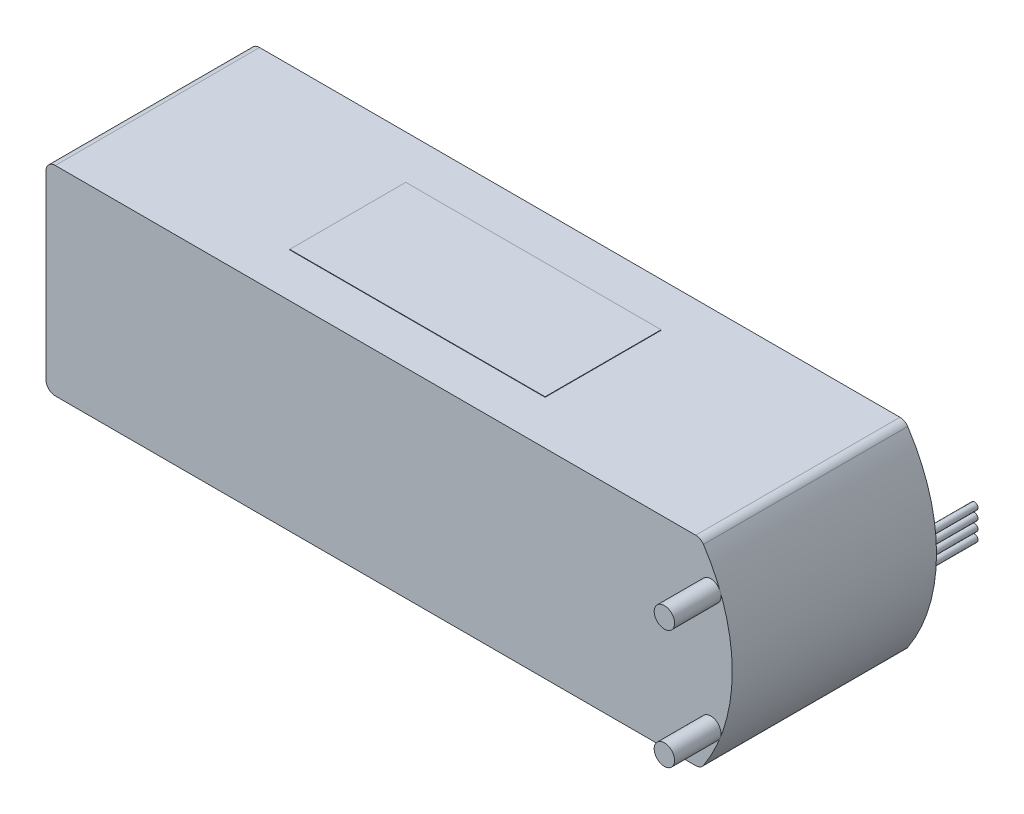
ISO-10303-21;
HEADER;
FILE_DESCRIPTION(('STEP AP214'),'2;1');
FILE_NAME('part.step','',(''),(''),'','','');
FILE_SCHEMA(('AUTOMOTIVE_DESIGN { 1 0 10303 214 1 1 1 1 }'));
ENDSEC;
DATA;
#1=APPLICATION_CONTEXT('core data for automotive mechanical design processes');
#2=APPLICATION_PROTOCOL_DEFINITION('international standard','automotive_design',2000,#1);
#3=PRODUCT_CONTEXT('',#1,'mechanical');
#4=PRODUCT('Part','Part','',(#3));
#5=PRODUCT_RELATED_PRODUCT_CATEGORY('part','',(#4));
#6=PRODUCT_DEFINITION_FORMATION('','',#4);
#7=PRODUCT_DEFINITION_CONTEXT('part definition',#1,'design');
#8=PRODUCT_DEFINITION('design','',#6,#7);
#9=PRODUCT_DEFINITION_SHAPE('','',#8);
#10=(LENGTH_UNIT() NAMED_UNIT(*) SI_UNIT(.MILLI.,.METRE.));
#11=(NAMED_UNIT(*) PLANE_ANGLE_UNIT() SI_UNIT($,.RADIAN.));
#12=(NAMED_UNIT(*) SI_UNIT($,.STERADIAN.) SOLID_ANGLE_UNIT());
#13=UNCERTAINTY_MEASURE_WITH_UNIT(LENGTH_MEASURE(1.E-05),#10,'distance_accuracy_value','');
#14=(GEOMETRIC_REPRESENTATION_CONTEXT(3) GLOBAL_UNCERTAINTY_ASSIGNED_CONTEXT((#13)) GLOBAL_UNIT_ASSIGNED_CONTEXT((#10,
#11,#12)) REPRESENTATION_CONTEXT('',''));
#15=CARTESIAN_POINT('',(0.,0.,0.));
#16=DIRECTION('',(0.,0.,1.));
#17=DIRECTION('',(1.,0.,0.));
#18=AXIS2_PLACEMENT_3D('',#15,#16,#17);
#19=CARTESIAN_POINT('',(75.5,-3.00000000000001,-32.));
#20=DIRECTION('',(0.,0.,1.));
#21=DIRECTION('',(1.,0.,0.));
#22=AXIS2_PLACEMENT_3D('',#19,#20,#21);
#23=CYLINDRICAL_SURFACE('',#22,0.749999999999999);
#24=CARTESIAN_POINT('',(75.5,-3.00000000000001,-32.));
#25=DIRECTION('',(0.,0.,-1.));
#26=DIRECTION('',(1.,0.,0.));
#27=AXIS2_PLACEMENT_3D('',#24,#25,#26);
#28=CIRCLE('',#27,0.749999999999999);
#29=CARTESIAN_POINT('',(76.25,-3.00000000000001,-32.));
#30=VERTEX_POINT('',#29);
#31=EDGE_CURVE('E11',#30,#30,#28,.T.);
#32=ORIENTED_EDGE('',*,*,#31,.F.);
#33=EDGE_LOOP('',(#32));
#34=FACE_BOUND('',#33,.T.);
#35=CARTESIAN_POINT('',(75.5,-3.00000000000001,-22.));
#36=DIRECTION('',(0.,0.,-1.));
#37=DIRECTION('',(1.,0.,0.));
#38=AXIS2_PLACEMENT_3D('',#35,#36,#37);
#39=CIRCLE('',#38,0.749999999999999);
#40=CARTESIAN_POINT('',(76.25,-3.00000000000001,-22.));
#41=VERTEX_POINT('',#40);
#42=EDGE_CURVE('E55',#41,#41,#39,.T.);
#43=ORIENTED_EDGE('',*,*,#42,.T.);
#44=EDGE_LOOP('',(#43));
#45=FACE_BOUND('',#44,.T.);
#46=ADVANCED_FACE('F52',(#34,#45),#23,.T.);
#47=CARTESIAN_POINT('',(75.5,-3.00000000000001,-32.));
#48=DIRECTION('',(0.,0.,1.));
#49=DIRECTION('',(1.,0.,0.));
#50=AXIS2_PLACEMENT_3D('',#47,#48,#49);
#51=PLANE('',#50);
#52=ORIENTED_EDGE('',*,*,#31,.T.);
#53=EDGE_LOOP('',(#52));
#54=FACE_BOUND('',#53,.T.);
#55=ADVANCED_FACE('F67',(#54),#51,.F.);
#56=CARTESIAN_POINT('',(75.5,-3.00000000000001,-22.));
#57=DIRECTION('',(0.,0.,1.));
#58=DIRECTION('',(1.,0.,0.));
#59=AXIS2_PLACEMENT_3D('',#56,#57,#58);
#60=PLANE('',#59);
#61=ORIENTED_EDGE('',*,*,#42,.F.);
#62=EDGE_LOOP('',(#61));
#63=FACE_BOUND('',#62,.T.);
#64=ADVANCED_FACE('F65',(#63),#60,.T.);
#65=CLOSED_SHELL('',(#46,#55,#64));
#66=MANIFOLD_SOLID_BREP('B2',#65);
#67=CARTESIAN_POINT('',(75.5,0.99999999999999,-32.));
#68=DIRECTION('',(0.,0.,1.));
#69=DIRECTION('',(1.,0.,0.));
#70=AXIS2_PLACEMENT_3D('',#67,#68,#69);
#71=CYLINDRICAL_SURFACE('',#70,0.749999999999999);
#72=CARTESIAN_POINT('',(75.5,0.99999999999999,-32.));
#73=DIRECTION('',(0.,0.,-1.));
#74=DIRECTION('',(-1.,0.,0.));
#75=AXIS2_PLACEMENT_3D('',#72,#73,#74);
#76=CIRCLE('',#75,0.749999999999999);
#77=CARTESIAN_POINT('',(74.75,0.99999999999999,-32.));
#78=VERTEX_POINT('',#77);
#79=EDGE_CURVE('E51',#78,#78,#76,.T.);
#80=ORIENTED_EDGE('',*,*,#79,.F.);
#81=EDGE_LOOP('',(#80));
#82=FACE_BOUND('',#81,.T.);
#83=CARTESIAN_POINT('',(75.5,0.99999999999999,-22.));
#84=DIRECTION('',(0.,0.,-1.));
#85=DIRECTION('',(-1.,0.,0.));
#86=AXIS2_PLACEMENT_3D('',#83,#84,#85);
#87=CIRCLE('',#86,0.749999999999999);
#88=CARTESIAN_POINT('',(74.75,0.99999999999999,-22.));
#89=VERTEX_POINT('',#88);
#90=EDGE_CURVE('E131',#89,#89,#87,.T.);
#91=ORIENTED_EDGE('',*,*,#90,.T.);
#92=EDGE_LOOP('',(#91));
#93=FACE_BOUND('',#92,.T.);
#94=ADVANCED_FACE('F128',(#82,#93),#71,.T.);
#95=CARTESIAN_POINT('',(75.5,0.99999999999999,-32.));
#96=DIRECTION('',(0.,0.,-1.));
#97=DIRECTION('',(-1.,0.,0.));
#98=AXIS2_PLACEMENT_3D('',#95,#96,#97);
#99=PLANE('',#98);
#100=ORIENTED_EDGE('',*,*,#79,.T.);
#101=EDGE_LOOP('',(#100));
#102=FACE_BOUND('',#101,.T.);
#103=ADVANCED_FACE('F143',(#102),#99,.T.);
#104=CARTESIAN_POINT('',(75.5,0.99999999999999,-22.));
#105=DIRECTION('',(0.,0.,-1.));
#106=DIRECTION('',(-1.,0.,0.));
#107=AXIS2_PLACEMENT_3D('',#104,#105,#106);
#108=PLANE('',#107);
#109=ORIENTED_EDGE('',*,*,#90,.F.);
#110=EDGE_LOOP('',(#109));
#111=FACE_BOUND('',#110,.T.);
#112=ADVANCED_FACE('F141',(#111),#108,.F.);
#113=CLOSED_SHELL('',(#94,#103,#112));
#114=MANIFOLD_SOLID_BREP('B6',#113);
#115=CARTESIAN_POINT('',(75.5,-1.00000000000001,-32.));
#116=DIRECTION('',(0.,0.,1.));
#117=DIRECTION('',(1.,0.,0.));
#118=AXIS2_PLACEMENT_3D('',#115,#116,#117);
#119=CYLINDRICAL_SURFACE('',#118,0.749999999999999);
#120=CARTESIAN_POINT('',(75.5,-1.00000000000001,-32.));
#121=DIRECTION('',(0.,0.,-1.));
#122=DIRECTION('',(1.,0.,0.));
#123=AXIS2_PLACEMENT_3D('',#120,#121,#122);
#124=CIRCLE('',#123,0.749999999999999);
#125=CARTESIAN_POINT('',(76.25,-1.00000000000001,-32.));
#126=VERTEX_POINT('',#125);
#127=EDGE_CURVE('E127',#126,#126,#124,.T.);
#128=ORIENTED_EDGE('',*,*,#127,.F.);
#129=EDGE_LOOP('',(#128));
#130=FACE_BOUND('',#129,.T.);
#131=CARTESIAN_POINT('',(75.5,-1.00000000000001,-22.));
#132=DIRECTION('',(0.,0.,-1.));
#133=DIRECTION('',(1.,0.,0.));
#134=AXIS2_PLACEMENT_3D('',#131,#132,#133);
#135=CIRCLE('',#134,0.749999999999999);
#136=CARTESIAN_POINT('',(76.25,-1.00000000000001,-22.));
#137=VERTEX_POINT('',#136);
#138=EDGE_CURVE('E207',#137,#137,#135,.T.);
#139=ORIENTED_EDGE('',*,*,#138,.T.);
#140=EDGE_LOOP('',(#139));
#141=FACE_BOUND('',#140,.T.);
#142=ADVANCED_FACE('F204',(#130,#141),#119,.T.);
#143=CARTESIAN_POINT('',(75.5,-1.00000000000001,-32.));
#144=DIRECTION('',(0.,0.,1.));
#145=DIRECTION('',(1.,0.,0.));
#146=AXIS2_PLACEMENT_3D('',#143,#144,#145);
#147=PLANE('',#146);
#148=ORIENTED_EDGE('',*,*,#127,.T.);
#149=EDGE_LOOP('',(#148));
#150=FACE_BOUND('',#149,.T.);
#151=ADVANCED_FACE('F219',(#150),#147,.F.);
#152=CARTESIAN_POINT('',(75.5,-1.00000000000001,-22.));
#153=DIRECTION('',(0.,0.,1.));
#154=DIRECTION('',(1.,0.,0.));
#155=AXIS2_PLACEMENT_3D('',#152,#153,#154);
#156=PLANE('',#155);
#157=ORIENTED_EDGE('',*,*,#138,.F.);
#158=EDGE_LOOP('',(#157));
#159=FACE_BOUND('',#158,.T.);
#160=ADVANCED_FACE('F217',(#159),#156,.T.);
#161=CLOSED_SHELL('',(#142,#151,#160));
#162=MANIFOLD_SOLID_BREP('B46',#161);
#163=CARTESIAN_POINT('',(75.5,2.99999999999999,-32.));
#164=DIRECTION('',(0.,0.,1.));
#165=DIRECTION('',(1.,0.,0.));
#166=AXIS2_PLACEMENT_3D('',#163,#164,#165);
#167=CYLINDRICAL_SURFACE('',#166,0.749999999999999);
#168=CARTESIAN_POINT('',(75.5,2.99999999999999,-32.));
#169=DIRECTION('',(0.,0.,-1.));
#170=DIRECTION('',(-1.,0.,0.));
#171=AXIS2_PLACEMENT_3D('',#168,#169,#170);
#172=CIRCLE('',#171,0.749999999999999);
#173=CARTESIAN_POINT('',(74.75,2.99999999999999,-32.));
#174=VERTEX_POINT('',#173);
#175=EDGE_CURVE('E203',#174,#174,#172,.T.);
#176=ORIENTED_EDGE('',*,*,#175,.F.);
#177=EDGE_LOOP('',(#176));
#178=FACE_BOUND('',#177,.T.);
#179=CARTESIAN_POINT('',(75.5,2.99999999999999,-22.));
#180=DIRECTION('',(0.,0.,-1.));
#181=DIRECTION('',(-1.,0.,0.));
#182=AXIS2_PLACEMENT_3D('',#179,#180,#181);
#183=CIRCLE('',#182,0.749999999999999);
#184=CARTESIAN_POINT('',(74.75,2.99999999999999,-22.));
#185=VERTEX_POINT('',#184);
#186=EDGE_CURVE('E283',#185,#185,#183,.T.);
#187=ORIENTED_EDGE('',*,*,#186,.T.);
#188=EDGE_LOOP('',(#187));
#189=FACE_BOUND('',#188,.T.);
#190=ADVANCED_FACE('F280',(#178,#189),#167,.T.);
#191=CARTESIAN_POINT('',(75.5,2.99999999999999,-32.));
#192=DIRECTION('',(0.,0.,-1.));
#193=DIRECTION('',(-1.,0.,0.));
#194=AXIS2_PLACEMENT_3D('',#191,#192,#193);
#195=PLANE('',#194);
#196=ORIENTED_EDGE('',*,*,#175,.T.);
#197=EDGE_LOOP('',(#196));
#198=FACE_BOUND('',#197,.T.);
#199=ADVANCED_FACE('F295',(#198),#195,.T.);
#200=CARTESIAN_POINT('',(75.5,2.99999999999999,-22.));
#201=DIRECTION('',(0.,0.,-1.));
#202=DIRECTION('',(-1.,0.,0.));
#203=AXIS2_PLACEMENT_3D('',#200,#201,#202);
#204=PLANE('',#203);
#205=ORIENTED_EDGE('',*,*,#186,.F.);
#206=EDGE_LOOP('',(#205));
#207=FACE_BOUND('',#206,.T.);
#208=ADVANCED_FACE('F293',(#207),#204,.F.);
#209=CLOSED_SHELL('',(#190,#199,#208));
#210=MANIFOLD_SOLID_BREP('B122',#209);
#211=CARTESIAN_POINT('',(72.7,-12.800728425289,32.));
#212=DIRECTION('',(0.,0.,-1.));
#213=DIRECTION('',(-1.,0.,0.));
#214=AXIS2_PLACEMENT_3D('',#211,#212,#213);
#215=CYLINDRICAL_SURFACE('',#214,2.2);
#216=CARTESIAN_POINT('',(72.7,-12.800728425289,32.));
#217=DIRECTION('',(0.,0.,1.));
#218=DIRECTION('',(-1.,0.,0.));
#219=AXIS2_PLACEMENT_3D('',#216,#217,#218);
#220=CIRCLE('',#219,2.2);
#221=CARTESIAN_POINT('',(70.5,-12.800728425289,32.));
#222=VERTEX_POINT('',#221);
#223=EDGE_CURVE('E279',#222,#222,#220,.T.);
#224=ORIENTED_EDGE('',*,*,#223,.F.);
#225=EDGE_LOOP('',(#224));
#226=FACE_BOUND('',#225,.T.);
#227=CARTESIAN_POINT('',(72.7,-12.800728425289,22.));
#228=DIRECTION('',(0.,0.,1.));
#229=DIRECTION('',(-1.,0.,0.));
#230=AXIS2_PLACEMENT_3D('',#227,#228,#229);
#231=CIRCLE('',#230,2.2);
#232=CARTESIAN_POINT('',(70.5,-12.800728425289,22.));
#233=VERTEX_POINT('',#232);
#234=EDGE_CURVE('E359',#233,#233,#231,.T.);
#235=ORIENTED_EDGE('',*,*,#234,.T.);
#236=EDGE_LOOP('',(#235));
#237=FACE_BOUND('',#236,.T.);
#238=ADVANCED_FACE('F356',(#226,#237),#215,.T.);
#239=CARTESIAN_POINT('',(72.7,-12.800728425289,32.));
#240=DIRECTION('',(0.,0.,-1.));
#241=DIRECTION('',(-1.,0.,0.));
#242=AXIS2_PLACEMENT_3D('',#239,#240,#241);
#243=PLANE('',#242);
#244=ORIENTED_EDGE('',*,*,#223,.T.);
#245=EDGE_LOOP('',(#244));
#246=FACE_BOUND('',#245,.T.);
#247=ADVANCED_FACE('F371',(#246),#243,.F.);
#248=CARTESIAN_POINT('',(72.7,-12.800728425289,22.));
#249=DIRECTION('',(0.,0.,-1.));
#250=DIRECTION('',(-1.,0.,0.));
#251=AXIS2_PLACEMENT_3D('',#248,#249,#250);
#252=PLANE('',#251);
#253=ORIENTED_EDGE('',*,*,#234,.F.);
#254=EDGE_LOOP('',(#253));
#255=FACE_BOUND('',#254,.T.);
#256=ADVANCED_FACE('F369',(#255),#252,.T.);
#257=CLOSED_SHELL('',(#238,#247,#256));
#258=MANIFOLD_SOLID_BREP('B198',#257);
#259=CARTESIAN_POINT('',(72.7,12.800728425289,32.));
#260=DIRECTION('',(0.,0.,-1.));
#261=DIRECTION('',(-1.,0.,0.));
#262=AXIS2_PLACEMENT_3D('',#259,#260,#261);
#263=CYLINDRICAL_SURFACE('',#262,2.2);
#264=CARTESIAN_POINT('',(72.7,12.800728425289,32.));
#265=DIRECTION('',(0.,0.,1.));
#266=DIRECTION('',(1.,0.,0.));
#267=AXIS2_PLACEMENT_3D('',#264,#265,#266);
#268=CIRCLE('',#267,2.2);
#269=CARTESIAN_POINT('',(74.9,12.800728425289,32.));
#270=VERTEX_POINT('',#269);
#271=EDGE_CURVE('E355',#270,#270,#268,.T.);
#272=ORIENTED_EDGE('',*,*,#271,.F.);
#273=EDGE_LOOP('',(#272));
#274=FACE_BOUND('',#273,.T.);
#275=CARTESIAN_POINT('',(72.7,12.800728425289,22.));
#276=DIRECTION('',(0.,0.,1.));
#277=DIRECTION('',(1.,0.,0.));
#278=AXIS2_PLACEMENT_3D('',#275,#276,#277);
#279=CIRCLE('',#278,2.2);
#280=CARTESIAN_POINT('',(74.9,12.800728425289,22.));
#281=VERTEX_POINT('',#280);
#282=EDGE_CURVE('E436',#281,#281,#279,.T.);
#283=ORIENTED_EDGE('',*,*,#282,.T.);
#284=EDGE_LOOP('',(#283));
#285=FACE_BOUND('',#284,.T.);
#286=ADVANCED_FACE('F433',(#274,#285),#263,.T.);
#287=CARTESIAN_POINT('',(72.7,12.800728425289,32.));
#288=DIRECTION('',(0.,0.,1.));
#289=DIRECTION('',(1.,0.,0.));
#290=AXIS2_PLACEMENT_3D('',#287,#288,#289);
#291=PLANE('',#290);
#292=ORIENTED_EDGE('',*,*,#271,.T.);
#293=EDGE_LOOP('',(#292));
#294=FACE_BOUND('',#293,.T.);
#295=ADVANCED_FACE('F448',(#294),#291,.T.);
#296=CARTESIAN_POINT('',(72.7,12.800728425289,22.));
#297=DIRECTION('',(0.,0.,1.));
#298=DIRECTION('',(1.,0.,0.));
#299=AXIS2_PLACEMENT_3D('',#296,#297,#298);
#300=PLANE('',#299);
#301=ORIENTED_EDGE('',*,*,#282,.F.);
#302=EDGE_LOOP('',(#301));
#303=FACE_BOUND('',#302,.T.);
#304=ADVANCED_FACE('F446',(#303),#300,.F.);
#305=CLOSED_SHELL('',(#286,#295,#304));
#306=MANIFOLD_SOLID_BREP('B274',#305);
#307=CARTESIAN_POINT('',(-70.5,21.5,22.));
#308=DIRECTION('',(0.,-1.,0.));
#309=DIRECTION('',(0.,0.,-1.));
#310=AXIS2_PLACEMENT_3D('',#307,#308,#309);
#311=PLANE('',#310);
#312=DIRECTION('',(-1.,0.,0.));
#313=VECTOR('',#312,1.);
#314=CARTESIAN_POINT('',(-70.5,21.5,22.));
#315=LINE('',#314,#313);
#316=CARTESIAN_POINT('',(69.4446113023018,21.5,22.));
#317=VERTEX_POINT('',#316);
#318=CARTESIAN_POINT('',(-68.5,21.5,22.));
#319=VERTEX_POINT('',#318);
#320=EDGE_CURVE('E634',#317,#319,#315,.T.);
#321=ORIENTED_EDGE('',*,*,#320,.F.);
#322=DIRECTION('',(0.,0.,-1.));
#323=VECTOR('',#322,1.);
#324=CARTESIAN_POINT('',(69.4446113023018,21.5,22.));
#325=LINE('',#324,#323);
#326=CARTESIAN_POINT('',(69.4446113023018,21.5,-22.));
#327=VERTEX_POINT('',#326);
#328=EDGE_CURVE('E694',#317,#327,#325,.T.);
#329=ORIENTED_EDGE('',*,*,#328,.T.);
#330=DIRECTION('',(-1.,0.,0.));
#331=VECTOR('',#330,1.);
#332=CARTESIAN_POINT('',(-70.5,21.5,-22.));
#333=LINE('',#332,#331);
#334=CARTESIAN_POINT('',(-68.5,21.5,-22.));
#335=VERTEX_POINT('',#334);
#336=EDGE_CURVE('E624',#327,#335,#333,.T.);
#337=ORIENTED_EDGE('',*,*,#336,.T.);
#338=DIRECTION('',(0.,0.,-1.));
#339=VECTOR('',#338,1.);
#340=CARTESIAN_POINT('',(-68.5,21.5,22.));
#341=LINE('',#340,#339);
#342=EDGE_CURVE('E691',#335,#319,#341,.F.);
#343=ORIENTED_EDGE('',*,*,#342,.T.);
#344=EDGE_LOOP('',(#321,#329,#337,#343));
#345=FACE_BOUND('',#344,.T.);
#346=DIRECTION('',(0.,0.,-1.));
#347=VECTOR('',#346,1.);
#348=CARTESIAN_POINT('',(27.5,21.5,-12.5));
#349=LINE('',#348,#347);
#350=CARTESIAN_POINT('',(27.5,21.5,12.5));
#351=VERTEX_POINT('',#350);
#352=CARTESIAN_POINT('',(27.5,21.5,-12.5));
#353=VERTEX_POINT('',#352);
#354=EDGE_CURVE('E617',#351,#353,#349,.T.);
#355=ORIENTED_EDGE('',*,*,#354,.F.);
#356=DIRECTION('',(1.,0.,0.));
#357=VECTOR('',#356,1.);
#358=CARTESIAN_POINT('',(-27.5,21.5,12.5));
#359=LINE('',#358,#357);
#360=CARTESIAN_POINT('',(-27.5,21.5,12.5));
#361=VERTEX_POINT('',#360);
#362=EDGE_CURVE('E614',#361,#351,#359,.T.);
#363=ORIENTED_EDGE('',*,*,#362,.F.);
#364=DIRECTION('',(0.,0.,1.));
#365=VECTOR('',#364,1.);
#366=CARTESIAN_POINT('',(-27.5,21.5,-12.5));
#367=LINE('',#366,#365);
#368=CARTESIAN_POINT('',(-27.5,21.5,-12.5));
#369=VERTEX_POINT('',#368);
#370=EDGE_CURVE('E917',#369,#361,#367,.T.);
#371=ORIENTED_EDGE('',*,*,#370,.F.);
#372=DIRECTION('',(-1.,0.,0.));
#373=VECTOR('',#372,1.);
#374=CARTESIAN_POINT('',(-27.5,21.5,-12.5));
#375=LINE('',#374,#373);
#376=EDGE_CURVE('E920',#353,#369,#375,.T.);
#377=ORIENTED_EDGE('',*,*,#376,.F.);
#378=EDGE_LOOP('',(#355,#363,#371,#377));
#379=FACE_BOUND('',#378,.T.);
#380=ADVANCED_FACE('F501',(#345,#379),#311,.F.);
#381=CARTESIAN_POINT('',(40.,0.,22.));
#382=DIRECTION('',(0.,0.,-1.));
#383=DIRECTION('',(-1.,0.,0.));
#384=AXIS2_PLACEMENT_3D('',#381,#382,#383);
#385=CYLINDRICAL_SURFACE('',#384,37.3162163140906);
#386=CARTESIAN_POINT('',(40.,0.,22.));
#387=DIRECTION('',(0.,0.,1.));
#388=DIRECTION('',(1.,0.,0.));
#389=AXIS2_PLACEMENT_3D('',#386,#387,#388);
#390=CIRCLE('',#389,37.3162163140906);
#391=CARTESIAN_POINT('',(71.1120952162313,-20.6043085604966,22.));
#392=VERTEX_POINT('',#391);
#393=CARTESIAN_POINT('',(71.1120952162313,20.6043085604966,22.));
#394=VERTEX_POINT('',#393);
#395=EDGE_CURVE('E630',#392,#394,#390,.T.);
#396=ORIENTED_EDGE('',*,*,#395,.F.);
#397=DIRECTION('',(0.,0.,-1.));
#398=VECTOR('',#397,1.);
#399=CARTESIAN_POINT('',(71.1120952162313,-20.6043085604966,22.));
#400=LINE('',#399,#398);
#401=CARTESIAN_POINT('',(71.1120952162313,-20.6043085604966,-22.));
#402=VERTEX_POINT('',#401);
#403=EDGE_CURVE('E657',#392,#402,#400,.T.);
#404=ORIENTED_EDGE('',*,*,#403,.T.);
#405=CARTESIAN_POINT('',(40.,0.,-22.));
#406=DIRECTION('',(0.,0.,1.));
#407=DIRECTION('',(1.,0.,0.));
#408=AXIS2_PLACEMENT_3D('',#405,#406,#407);
#409=CIRCLE('',#408,37.3162163140906);
#410=CARTESIAN_POINT('',(71.1120952162313,20.6043085604966,-22.));
#411=VERTEX_POINT('',#410);
#412=EDGE_CURVE('E619',#402,#411,#409,.T.);
#413=ORIENTED_EDGE('',*,*,#412,.T.);
#414=DIRECTION('',(0.,0.,-1.));
#415=VECTOR('',#414,1.);
#416=CARTESIAN_POINT('',(71.1120952162313,20.6043085604966,22.));
#417=LINE('',#416,#415);
#418=EDGE_CURVE('E644',#411,#394,#417,.F.);
#419=ORIENTED_EDGE('',*,*,#418,.T.);
#420=EDGE_LOOP('',(#396,#404,#413,#419));
#421=FACE_BOUND('',#420,.T.);
#422=ADVANCED_FACE('F723',(#421),#385,.T.);
#423=CARTESIAN_POINT('',(-70.5,21.5,22.));
#424=DIRECTION('',(1.,0.,0.));
#425=DIRECTION('',(0.,0.,-1.));
#426=AXIS2_PLACEMENT_3D('',#423,#424,#425);
#427=PLANE('',#426);
#428=DIRECTION('',(0.,-1.,0.));
#429=VECTOR('',#428,1.);
#430=CARTESIAN_POINT('',(-70.5,21.5,-22.));
#431=LINE('',#430,#429);
#432=CARTESIAN_POINT('',(-70.5,19.5,-22.));
#433=VERTEX_POINT('',#432);
#434=CARTESIAN_POINT('',(-70.5,-19.5,-22.));
#435=VERTEX_POINT('',#434);
#436=EDGE_CURVE('E649',#433,#435,#431,.T.);
#437=ORIENTED_EDGE('',*,*,#436,.T.);
#438=DIRECTION('',(0.,0.,-1.));
#439=VECTOR('',#438,1.);
#440=CARTESIAN_POINT('',(-70.5,-19.5,22.));
#441=LINE('',#440,#439);
#442=CARTESIAN_POINT('',(-70.5,-19.5,22.));
#443=VERTEX_POINT('',#442);
#444=EDGE_CURVE('E431',#435,#443,#441,.F.);
#445=ORIENTED_EDGE('',*,*,#444,.T.);
#446=DIRECTION('',(0.,-1.,0.));
#447=VECTOR('',#446,1.);
#448=CARTESIAN_POINT('',(-70.5,21.5,22.));
#449=LINE('',#448,#447);
#450=CARTESIAN_POINT('',(-70.5,19.5,22.));
#451=VERTEX_POINT('',#450);
#452=EDGE_CURVE('E638',#451,#443,#449,.T.);
#453=ORIENTED_EDGE('',*,*,#452,.F.);
#454=DIRECTION('',(0.,0.,-1.));
#455=VECTOR('',#454,1.);
#456=CARTESIAN_POINT('',(-70.5,19.5,22.));
#457=LINE('',#456,#455);
#458=EDGE_CURVE('E510',#451,#433,#457,.T.);
#459=ORIENTED_EDGE('',*,*,#458,.T.);
#460=EDGE_LOOP('',(#437,#445,#453,#459));
#461=FACE_BOUND('',#460,.T.);
#462=ADVANCED_FACE('F701',(#461),#427,.F.);
#463=CARTESIAN_POINT('',(-70.5,-21.5,22.));
#464=DIRECTION('',(0.,1.,0.));
#465=DIRECTION('',(0.,0.,1.));
#466=AXIS2_PLACEMENT_3D('',#463,#464,#465);
#467=PLANE('',#466);
#468=DIRECTION('',(1.,0.,0.));
#469=VECTOR('',#468,1.);
#470=CARTESIAN_POINT('',(-70.5,-21.5,-22.));
#471=LINE('',#470,#469);
#472=CARTESIAN_POINT('',(-68.5,-21.5,-22.));
#473=VERTEX_POINT('',#472);
#474=CARTESIAN_POINT('',(69.4446113023018,-21.5,-22.));
#475=VERTEX_POINT('',#474);
#476=EDGE_CURVE('E635',#473,#475,#471,.T.);
#477=ORIENTED_EDGE('',*,*,#476,.T.);
#478=DIRECTION('',(0.,0.,-1.));
#479=VECTOR('',#478,1.);
#480=CARTESIAN_POINT('',(69.4446113023018,-21.5,22.));
#481=LINE('',#480,#479);
#482=CARTESIAN_POINT('',(69.4446113023018,-21.5,22.));
#483=VERTEX_POINT('',#482);
#484=EDGE_CURVE('E677',#475,#483,#481,.F.);
#485=ORIENTED_EDGE('',*,*,#484,.T.);
#486=DIRECTION('',(1.,0.,0.));
#487=VECTOR('',#486,1.);
#488=CARTESIAN_POINT('',(-70.5,-21.5,22.));
#489=LINE('',#488,#487);
#490=CARTESIAN_POINT('',(-68.5,-21.5,22.));
#491=VERTEX_POINT('',#490);
#492=EDGE_CURVE('E641',#491,#483,#489,.T.);
#493=ORIENTED_EDGE('',*,*,#492,.F.);
#494=DIRECTION('',(0.,0.,-1.));
#495=VECTOR('',#494,1.);
#496=CARTESIAN_POINT('',(-68.5,-21.5,22.));
#497=LINE('',#496,#495);
#498=EDGE_CURVE('E673',#491,#473,#497,.T.);
#499=ORIENTED_EDGE('',*,*,#498,.T.);
#500=EDGE_LOOP('',(#477,#485,#493,#499));
#501=FACE_BOUND('',#500,.T.);
#502=ADVANCED_FACE('F714',(#501),#467,.F.);
#503=CARTESIAN_POINT('',(40.,0.,22.));
#504=DIRECTION('',(0.,0.,1.));
#505=DIRECTION('',(1.,0.,0.));
#506=AXIS2_PLACEMENT_3D('',#503,#504,#505);
#507=PLANE('',#506);
#508=ORIENTED_EDGE('',*,*,#492,.T.);
#509=CARTESIAN_POINT('',(69.4446113023018,-19.5,22.));
#510=DIRECTION('',(0.,0.,1.));
#511=DIRECTION('',(1.,0.,0.));
#512=AXIS2_PLACEMENT_3D('',#509,#510,#511);
#513=CIRCLE('',#512,2.);
#514=EDGE_CURVE('E688',#483,#392,#513,.T.);
#515=ORIENTED_EDGE('',*,*,#514,.T.);
#516=ORIENTED_EDGE('',*,*,#395,.T.);
#517=CARTESIAN_POINT('',(69.4446113023018,19.5,22.));
#518=DIRECTION('',(0.,0.,1.));
#519=DIRECTION('',(1.,0.,0.));
#520=AXIS2_PLACEMENT_3D('',#517,#518,#519);
#521=CIRCLE('',#520,2.);
#522=EDGE_CURVE('E685',#394,#317,#521,.T.);
#523=ORIENTED_EDGE('',*,*,#522,.T.);
#524=ORIENTED_EDGE('',*,*,#320,.T.);
#525=CARTESIAN_POINT('',(-68.5,19.5,22.));
#526=DIRECTION('',(0.,0.,1.));
#527=DIRECTION('',(1.,0.,0.));
#528=AXIS2_PLACEMENT_3D('',#525,#526,#527);
#529=CIRCLE('',#528,2.);
#530=EDGE_CURVE('E522',#319,#451,#529,.T.);
#531=ORIENTED_EDGE('',*,*,#530,.T.);
#532=ORIENTED_EDGE('',*,*,#452,.T.);
#533=CARTESIAN_POINT('',(-68.5,-19.5,22.));
#534=DIRECTION('',(0.,0.,1.));
#535=DIRECTION('',(1.,0.,0.));
#536=AXIS2_PLACEMENT_3D('',#533,#534,#535);
#537=CIRCLE('',#536,2.);
#538=EDGE_CURVE('E682',#443,#491,#537,.T.);
#539=ORIENTED_EDGE('',*,*,#538,.T.);
#540=EDGE_LOOP('',(#508,#515,#516,#523,#524,#531,#532,#539));
#541=FACE_BOUND('',#540,.T.);
#542=ADVANCED_FACE('F717',(#541),#507,.T.);
#543=CARTESIAN_POINT('',(40.,0.,-22.));
#544=DIRECTION('',(0.,0.,1.));
#545=DIRECTION('',(1.,0.,0.));
#546=AXIS2_PLACEMENT_3D('',#543,#544,#545);
#547=PLANE('',#546);
#548=ORIENTED_EDGE('',*,*,#412,.F.);
#549=CARTESIAN_POINT('',(69.4446113023018,-19.5,-22.));
#550=DIRECTION('',(0.,0.,1.));
#551=DIRECTION('',(1.,0.,0.));
#552=AXIS2_PLACEMENT_3D('',#549,#550,#551);
#553=CIRCLE('',#552,2.);
#554=EDGE_CURVE('E670',#402,#475,#553,.F.);
#555=ORIENTED_EDGE('',*,*,#554,.T.);
#556=ORIENTED_EDGE('',*,*,#476,.F.);
#557=CARTESIAN_POINT('',(-68.5,-19.5,-22.));
#558=DIRECTION('',(0.,0.,1.));
#559=DIRECTION('',(1.,0.,0.));
#560=AXIS2_PLACEMENT_3D('',#557,#558,#559);
#561=CIRCLE('',#560,2.);
#562=EDGE_CURVE('E664',#473,#435,#561,.F.);
#563=ORIENTED_EDGE('',*,*,#562,.T.);
#564=ORIENTED_EDGE('',*,*,#436,.F.);
#565=CARTESIAN_POINT('',(-68.5,19.5,-22.));
#566=DIRECTION('',(0.,0.,1.));
#567=DIRECTION('',(1.,0.,0.));
#568=AXIS2_PLACEMENT_3D('',#565,#566,#567);
#569=CIRCLE('',#568,2.);
#570=EDGE_CURVE('E661',#433,#335,#569,.F.);
#571=ORIENTED_EDGE('',*,*,#570,.T.);
#572=ORIENTED_EDGE('',*,*,#336,.F.);
#573=CARTESIAN_POINT('',(69.4446113023018,19.5,-22.));
#574=DIRECTION('',(0.,0.,1.));
#575=DIRECTION('',(1.,0.,0.));
#576=AXIS2_PLACEMENT_3D('',#573,#574,#575);
#577=CIRCLE('',#576,2.);
#578=EDGE_CURVE('E667',#327,#411,#577,.F.);
#579=ORIENTED_EDGE('',*,*,#578,.T.);
#580=EDGE_LOOP('',(#548,#555,#556,#563,#564,#571,#572,#579));
#581=FACE_BOUND('',#580,.T.);
#582=ADVANCED_FACE('F705',(#581),#547,.F.);
#583=CARTESIAN_POINT('',(27.5,21.6,-12.5));
#584=DIRECTION('',(-1.,0.,0.));
#585=DIRECTION('',(0.,0.,1.));
#586=AXIS2_PLACEMENT_3D('',#583,#584,#585);
#587=PLANE('',#586);
#588=ORIENTED_EDGE('',*,*,#354,.T.);
#589=DIRECTION('',(0.,-1.,0.));
#590=VECTOR('',#589,1.);
#591=CARTESIAN_POINT('',(27.5,21.6,-12.5));
#592=LINE('',#591,#590);
#593=CARTESIAN_POINT('',(27.5,21.6,-12.5));
#594=VERTEX_POINT('',#593);
#595=EDGE_CURVE('E596',#594,#353,#592,.T.);
#596=ORIENTED_EDGE('',*,*,#595,.F.);
#597=DIRECTION('',(0.,0.,-1.));
#598=VECTOR('',#597,1.);
#599=CARTESIAN_POINT('',(27.5,21.6,-12.5));
#600=LINE('',#599,#598);
#601=CARTESIAN_POINT('',(27.5,21.6,12.5));
#602=VERTEX_POINT('',#601);
#603=EDGE_CURVE('E604',#602,#594,#600,.T.);
#604=ORIENTED_EDGE('',*,*,#603,.F.);
#605=DIRECTION('',(0.,-1.,0.));
#606=VECTOR('',#605,1.);
#607=CARTESIAN_POINT('',(27.5,21.6,12.5));
#608=LINE('',#607,#606);
#609=EDGE_CURVE('E924',#602,#351,#608,.T.);
#610=ORIENTED_EDGE('',*,*,#609,.T.);
#611=EDGE_LOOP('',(#588,#596,#604,#610));
#612=FACE_BOUND('',#611,.T.);
#613=ADVANCED_FACE('F616',(#612),#587,.F.);
#614=CARTESIAN_POINT('',(-27.5,21.6,-12.5));
#615=DIRECTION('',(0.,0.,1.));
#616=DIRECTION('',(1.,0.,0.));
#617=AXIS2_PLACEMENT_3D('',#614,#615,#616);
#618=PLANE('',#617);
#619=ORIENTED_EDGE('',*,*,#376,.T.);
#620=DIRECTION('',(0.,-1.,0.));
#621=VECTOR('',#620,1.);
#622=CARTESIAN_POINT('',(-27.5,21.6,-12.5));
#623=LINE('',#622,#621);
#624=CARTESIAN_POINT('',(-27.5,21.6,-12.5));
#625=VERTEX_POINT('',#624);
#626=EDGE_CURVE('E599',#625,#369,#623,.T.);
#627=ORIENTED_EDGE('',*,*,#626,.F.);
#628=DIRECTION('',(-1.,0.,0.));
#629=VECTOR('',#628,1.);
#630=CARTESIAN_POINT('',(-27.5,21.6,-12.5));
#631=LINE('',#630,#629);
#632=EDGE_CURVE('E591',#594,#625,#631,.T.);
#633=ORIENTED_EDGE('',*,*,#632,.F.);
#634=ORIENTED_EDGE('',*,*,#595,.T.);
#635=EDGE_LOOP('',(#619,#627,#633,#634));
#636=FACE_BOUND('',#635,.T.);
#637=ADVANCED_FACE('F594',(#636),#618,.F.);
#638=CARTESIAN_POINT('',(-27.5,21.6,-12.5));
#639=DIRECTION('',(1.,0.,0.));
#640=DIRECTION('',(0.,0.,-1.));
#641=AXIS2_PLACEMENT_3D('',#638,#639,#640);
#642=PLANE('',#641);
#643=ORIENTED_EDGE('',*,*,#370,.T.);
#644=DIRECTION('',(0.,-1.,0.));
#645=VECTOR('',#644,1.);
#646=CARTESIAN_POINT('',(-27.5,21.6,12.5));
#647=LINE('',#646,#645);
#648=CARTESIAN_POINT('',(-27.5,21.6,12.5));
#649=VERTEX_POINT('',#648);
#650=EDGE_CURVE('E626',#649,#361,#647,.T.);
#651=ORIENTED_EDGE('',*,*,#650,.F.);
#652=DIRECTION('',(0.,0.,1.));
#653=VECTOR('',#652,1.);
#654=CARTESIAN_POINT('',(-27.5,21.6,-12.5));
#655=LINE('',#654,#653);
#656=EDGE_CURVE('E603',#625,#649,#655,.T.);
#657=ORIENTED_EDGE('',*,*,#656,.F.);
#658=ORIENTED_EDGE('',*,*,#626,.T.);
#659=EDGE_LOOP('',(#643,#651,#657,#658));
#660=FACE_BOUND('',#659,.T.);
#661=ADVANCED_FACE('F829',(#660),#642,.F.);
#662=CARTESIAN_POINT('',(-27.5,21.6,12.5));
#663=DIRECTION('',(0.,0.,-1.));
#664=DIRECTION('',(-1.,0.,0.));
#665=AXIS2_PLACEMENT_3D('',#662,#663,#664);
#666=PLANE('',#665);
#667=ORIENTED_EDGE('',*,*,#362,.T.);
#668=ORIENTED_EDGE('',*,*,#609,.F.);
#669=DIRECTION('',(1.,0.,0.));
#670=VECTOR('',#669,1.);
#671=CARTESIAN_POINT('',(-27.5,21.6,12.5));
#672=LINE('',#671,#670);
#673=EDGE_CURVE('E609',#649,#602,#672,.T.);
#674=ORIENTED_EDGE('',*,*,#673,.F.);
#675=ORIENTED_EDGE('',*,*,#650,.T.);
#676=EDGE_LOOP('',(#667,#668,#674,#675));
#677=FACE_BOUND('',#676,.T.);
#678=ADVANCED_FACE('F817',(#677),#666,.F.);
#679=CARTESIAN_POINT('',(0.,21.6,0.));
#680=DIRECTION('',(0.,1.,0.));
#681=DIRECTION('',(0.,0.,1.));
#682=AXIS2_PLACEMENT_3D('',#679,#680,#681);
#683=PLANE('',#682);
#684=ORIENTED_EDGE('',*,*,#603,.T.);
#685=ORIENTED_EDGE('',*,*,#632,.T.);
#686=ORIENTED_EDGE('',*,*,#656,.T.);
#687=ORIENTED_EDGE('',*,*,#673,.T.);
#688=EDGE_LOOP('',(#684,#685,#686,#687));
#689=FACE_BOUND('',#688,.T.);
#690=ADVANCED_FACE('F607',(#689),#683,.T.);
#691=CARTESIAN_POINT('',(69.4446113023018,-19.5,22.));
#692=DIRECTION('',(0.,0.,-1.));
#693=DIRECTION('',(-1.,0.,0.));
#694=AXIS2_PLACEMENT_3D('',#691,#692,#693);
#695=CYLINDRICAL_SURFACE('',#694,2.);
#696=ORIENTED_EDGE('',*,*,#514,.F.);
#697=ORIENTED_EDGE('',*,*,#484,.F.);
#698=ORIENTED_EDGE('',*,*,#554,.F.);
#699=ORIENTED_EDGE('',*,*,#403,.F.);
#700=EDGE_LOOP('',(#696,#697,#698,#699));
#701=FACE_BOUND('',#700,.T.);
#702=ADVANCED_FACE('F721',(#701),#695,.T.);
#703=CARTESIAN_POINT('',(69.4446113023018,19.5,22.));
#704=DIRECTION('',(0.,0.,-1.));
#705=DIRECTION('',(-1.,0.,0.));
#706=AXIS2_PLACEMENT_3D('',#703,#704,#705);
#707=CYLINDRICAL_SURFACE('',#706,2.);
#708=ORIENTED_EDGE('',*,*,#522,.F.);
#709=ORIENTED_EDGE('',*,*,#418,.F.);
#710=ORIENTED_EDGE('',*,*,#578,.F.);
#711=ORIENTED_EDGE('',*,*,#328,.F.);
#712=EDGE_LOOP('',(#708,#709,#710,#711));
#713=FACE_BOUND('',#712,.T.);
#714=ADVANCED_FACE('F728',(#713),#707,.T.);
#715=CARTESIAN_POINT('',(-68.5,-19.5,22.));
#716=DIRECTION('',(0.,0.,-1.));
#717=DIRECTION('',(-1.,0.,0.));
#718=AXIS2_PLACEMENT_3D('',#715,#716,#717);
#719=CYLINDRICAL_SURFACE('',#718,2.);
#720=ORIENTED_EDGE('',*,*,#538,.F.);
#721=ORIENTED_EDGE('',*,*,#444,.F.);
#722=ORIENTED_EDGE('',*,*,#562,.F.);
#723=ORIENTED_EDGE('',*,*,#498,.F.);
#724=EDGE_LOOP('',(#720,#721,#722,#723));
#725=FACE_BOUND('',#724,.T.);
#726=ADVANCED_FACE('F711',(#725),#719,.T.);
#727=CARTESIAN_POINT('',(-68.5,19.5,22.));
#728=DIRECTION('',(0.,0.,-1.));
#729=DIRECTION('',(-1.,0.,0.));
#730=AXIS2_PLACEMENT_3D('',#727,#728,#729);
#731=CYLINDRICAL_SURFACE('',#730,2.);
#732=ORIENTED_EDGE('',*,*,#530,.F.);
#733=ORIENTED_EDGE('',*,*,#342,.F.);
#734=ORIENTED_EDGE('',*,*,#570,.F.);
#735=ORIENTED_EDGE('',*,*,#458,.F.);
#736=EDGE_LOOP('',(#732,#733,#734,#735));
#737=FACE_BOUND('',#736,.T.);
#738=ADVANCED_FACE('F503',(#737),#731,.T.);
#739=CLOSED_SHELL('',(#380,#422,#462,#502,#542,#582,#613,#637,#661,#678,#690,#702,#714,#726,#738));
#740=MANIFOLD_SOLID_BREP('B350',#739);
#741=ADVANCED_BREP_SHAPE_REPRESENTATION('',(#18,#66,#114,#162,#210,#258,#306,#740),#14);
#742=SHAPE_DEFINITION_REPRESENTATION(#9,#741);
ENDSEC;
END-ISO-10303-21;
